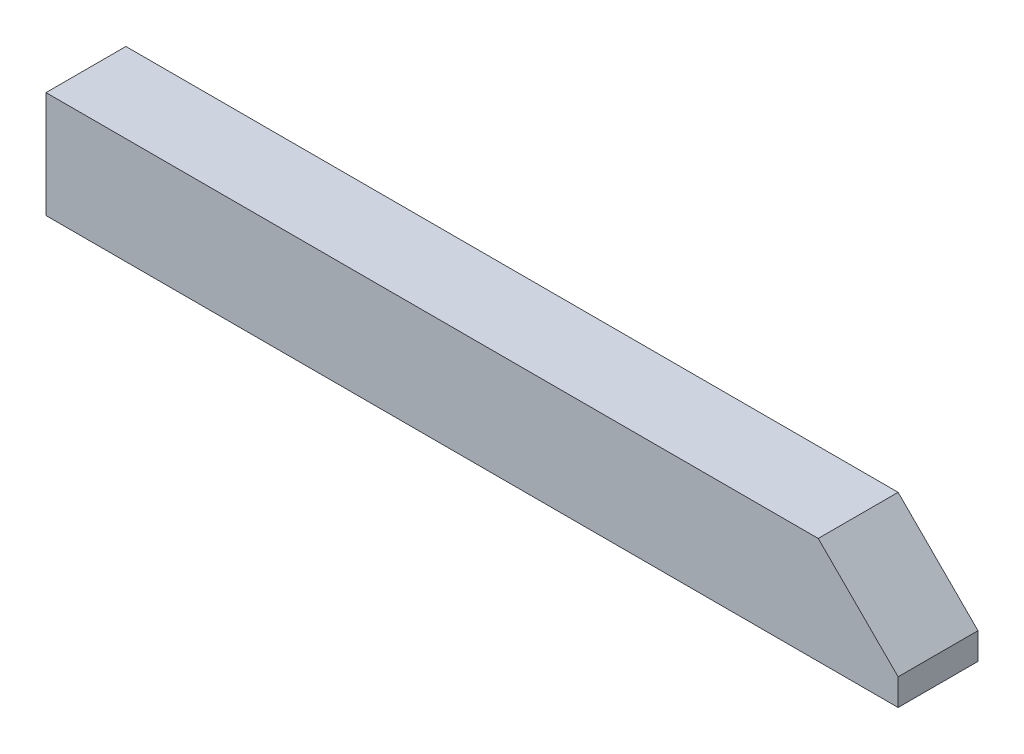
ISO-10303-21;
HEADER;
FILE_DESCRIPTION(('STEP AP214'),'2;1');
FILE_NAME('part.step','',(''),(''),'','','');
FILE_SCHEMA(('AUTOMOTIVE_DESIGN { 1 0 10303 214 1 1 1 1 }'));
ENDSEC;
DATA;
#1=APPLICATION_CONTEXT('core data for automotive mechanical design processes');
#2=APPLICATION_PROTOCOL_DEFINITION('international standard','automotive_design',2000,#1);
#3=PRODUCT_CONTEXT('',#1,'mechanical');
#4=PRODUCT('Part','Part','',(#3));
#5=PRODUCT_RELATED_PRODUCT_CATEGORY('part','',(#4));
#6=PRODUCT_DEFINITION_FORMATION('','',#4);
#7=PRODUCT_DEFINITION_CONTEXT('part definition',#1,'design');
#8=PRODUCT_DEFINITION('design','',#6,#7);
#9=PRODUCT_DEFINITION_SHAPE('','',#8);
#10=(LENGTH_UNIT() NAMED_UNIT(*) SI_UNIT(.MILLI.,.METRE.));
#11=(NAMED_UNIT(*) PLANE_ANGLE_UNIT() SI_UNIT($,.RADIAN.));
#12=(NAMED_UNIT(*) SI_UNIT($,.STERADIAN.) SOLID_ANGLE_UNIT());
#13=UNCERTAINTY_MEASURE_WITH_UNIT(LENGTH_MEASURE(1.E-05),#10,'distance_accuracy_value','');
#14=(GEOMETRIC_REPRESENTATION_CONTEXT(3) GLOBAL_UNCERTAINTY_ASSIGNED_CONTEXT((#13)) GLOBAL_UNIT_ASSIGNED_CONTEXT((#10,
#11,#12)) REPRESENTATION_CONTEXT('',''));
#15=CARTESIAN_POINT('',(0.,0.,0.));
#16=DIRECTION('',(0.,0.,1.));
#17=DIRECTION('',(1.,0.,0.));
#18=AXIS2_PLACEMENT_3D('',#15,#16,#17);
#19=CARTESIAN_POINT('',(51.122900390625,47.080400390625,1.156800003052));
#20=DIRECTION('',(0.,0.,1.));
#21=DIRECTION('',(1.,0.,0.));
#22=AXIS2_PLACEMENT_3D('',#19,#20,#21);
#23=PLANE('',#22);
#24=DIRECTION('',(1.,0.,0.));
#25=VECTOR('',#24,1.);
#26=CARTESIAN_POINT('',(51.122900390625,46.980400390997,1.156800003052));
#27=LINE('',#26,#25);
#28=CARTESIAN_POINT('',(50.322900393605,46.980400390997,1.156800003052));
#29=VERTEX_POINT('',#28);
#30=CARTESIAN_POINT('',(51.922900387645,46.980400390997,1.156800003052));
#31=VERTEX_POINT('',#30);
#32=EDGE_CURVE('E11',#29,#31,#27,.T.);
#33=ORIENTED_EDGE('',*,*,#32,.F.);
#34=DIRECTION('',(0.,-1.,0.));
#35=VECTOR('',#34,1.);
#36=CARTESIAN_POINT('',(50.322900393605,47.080400390625,1.156800003052));
#37=LINE('',#36,#35);
#38=CARTESIAN_POINT('',(50.322900393605,47.180400390252,1.156800003052));
#39=VERTEX_POINT('',#38);
#40=EDGE_CURVE('E101',#39,#29,#37,.T.);
#41=ORIENTED_EDGE('',*,*,#40,.F.);
#42=DIRECTION('',(-1.,0.,0.));
#43=VECTOR('',#42,1.);
#44=CARTESIAN_POINT('',(51.122900390625,47.180400390252,1.156800003052));
#45=LINE('',#44,#43);
#46=CARTESIAN_POINT('',(51.772900387645,47.180400390252,1.156800003052));
#47=VERTEX_POINT('',#46);
#48=EDGE_CURVE('E64',#47,#39,#45,.T.);
#49=ORIENTED_EDGE('',*,*,#48,.F.);
#50=DIRECTION('',(-0.707106781186548,0.707106781186548,0.));
#51=VECTOR('',#50,1.);
#52=CARTESIAN_POINT('',(51.847900387645,47.105400390253,1.156800003052));
#53=LINE('',#52,#51);
#54=CARTESIAN_POINT('',(51.922900387645,47.030400390252,1.156800003052));
#55=VERTEX_POINT('',#54);
#56=EDGE_CURVE('E122',#55,#47,#53,.T.);
#57=ORIENTED_EDGE('',*,*,#56,.F.);
#58=DIRECTION('',(0.,1.,0.));
#59=VECTOR('',#58,1.);
#60=CARTESIAN_POINT('',(51.922900387645,47.080400390625,1.156800003052));
#61=LINE('',#60,#59);
#62=EDGE_CURVE('E26',#31,#55,#61,.T.);
#63=ORIENTED_EDGE('',*,*,#62,.F.);
#64=EDGE_LOOP('',(#33,#41,#49,#57,#63));
#65=FACE_BOUND('',#64,.T.);
#66=ADVANCED_FACE('F17',(#65),#23,.F.);
#67=CARTESIAN_POINT('',(51.122900390625,46.980400390997,1.156800003052));
#68=DIRECTION('',(0.,-1.,0.));
#69=DIRECTION('',(-1.,0.,0.));
#70=AXIS2_PLACEMENT_3D('',#67,#68,#69);
#71=PLANE('',#70);
#72=DIRECTION('',(1.,0.,0.));
#73=VECTOR('',#72,1.);
#74=CARTESIAN_POINT('',(51.122900390625,46.980400390997,1.306800003052));
#75=LINE('',#74,#73);
#76=CARTESIAN_POINT('',(50.322900393605,46.980400390997,1.306800003052));
#77=VERTEX_POINT('',#76);
#78=CARTESIAN_POINT('',(51.922900387645,46.980400390997,1.306800003052));
#79=VERTEX_POINT('',#78);
#80=EDGE_CURVE('E112',#77,#79,#75,.T.);
#81=ORIENTED_EDGE('',*,*,#80,.F.);
#82=DIRECTION('',(0.,0.,1.));
#83=VECTOR('',#82,1.);
#84=CARTESIAN_POINT('',(50.322900393605,46.980400390997,1.156800003052));
#85=LINE('',#84,#83);
#86=EDGE_CURVE('E107',#29,#77,#85,.T.);
#87=ORIENTED_EDGE('',*,*,#86,.F.);
#88=ORIENTED_EDGE('',*,*,#32,.T.);
#89=DIRECTION('',(0.,0.,-1.));
#90=VECTOR('',#89,1.);
#91=CARTESIAN_POINT('',(51.922900387645,46.980400390997,1.156800003052));
#92=LINE('',#91,#90);
#93=EDGE_CURVE('E20',#79,#31,#92,.T.);
#94=ORIENTED_EDGE('',*,*,#93,.F.);
#95=EDGE_LOOP('',(#81,#87,#88,#94));
#96=FACE_BOUND('',#95,.T.);
#97=ADVANCED_FACE('F189',(#96),#71,.T.);
#98=CARTESIAN_POINT('',(51.922900387645,47.080400390625,1.156800003052));
#99=DIRECTION('',(1.,0.,0.));
#100=DIRECTION('',(0.,-1.,0.));
#101=AXIS2_PLACEMENT_3D('',#98,#99,#100);
#102=PLANE('',#101);
#103=DIRECTION('',(0.,0.,-1.));
#104=VECTOR('',#103,1.);
#105=CARTESIAN_POINT('',(51.922900387645,47.030400390252,1.156800003052));
#106=LINE('',#105,#104);
#107=CARTESIAN_POINT('',(51.922900387645,47.030400390252,1.306800003052));
#108=VERTEX_POINT('',#107);
#109=EDGE_CURVE('E76',#108,#55,#106,.T.);
#110=ORIENTED_EDGE('',*,*,#109,.F.);
#111=DIRECTION('',(0.,1.,0.));
#112=VECTOR('',#111,1.);
#113=CARTESIAN_POINT('',(51.922900387645,47.080400390625,1.306800003052));
#114=LINE('',#113,#112);
#115=EDGE_CURVE('E128',#79,#108,#114,.T.);
#116=ORIENTED_EDGE('',*,*,#115,.F.);
#117=ORIENTED_EDGE('',*,*,#93,.T.);
#118=ORIENTED_EDGE('',*,*,#62,.T.);
#119=EDGE_LOOP('',(#110,#116,#117,#118));
#120=FACE_BOUND('',#119,.T.);
#121=ADVANCED_FACE('F183',(#120),#102,.T.);
#122=CARTESIAN_POINT('',(51.847900387645,47.105400390253,1.156800003052));
#123=DIRECTION('',(0.707106781186548,0.707106781186548,0.));
#124=DIRECTION('',(0.,0.,-1.));
#125=AXIS2_PLACEMENT_3D('',#122,#123,#124);
#126=PLANE('',#125);
#127=DIRECTION('',(-0.707106781186548,0.707106781186548,0.));
#128=VECTOR('',#127,1.);
#129=CARTESIAN_POINT('',(51.922900387645,47.030400390252,1.306800003052));
#130=LINE('',#129,#128);
#131=CARTESIAN_POINT('',(51.772900387645,47.180400390252,1.306800003052));
#132=VERTEX_POINT('',#131);
#133=EDGE_CURVE('E102',#108,#132,#130,.T.);
#134=ORIENTED_EDGE('',*,*,#133,.F.);
#135=ORIENTED_EDGE('',*,*,#109,.T.);
#136=ORIENTED_EDGE('',*,*,#56,.T.);
#137=DIRECTION('',(0.,0.,-1.));
#138=VECTOR('',#137,1.);
#139=CARTESIAN_POINT('',(51.772900387645,47.180400390252,1.156800003052));
#140=LINE('',#139,#138);
#141=EDGE_CURVE('E88',#132,#47,#140,.T.);
#142=ORIENTED_EDGE('',*,*,#141,.F.);
#143=EDGE_LOOP('',(#134,#135,#136,#142));
#144=FACE_BOUND('',#143,.T.);
#145=ADVANCED_FACE('F188',(#144),#126,.T.);
#146=CARTESIAN_POINT('',(51.122900390625,47.180400390252,1.156800003052));
#147=DIRECTION('',(0.,1.,0.));
#148=DIRECTION('',(1.,0.,0.));
#149=AXIS2_PLACEMENT_3D('',#146,#147,#148);
#150=PLANE('',#149);
#151=ORIENTED_EDGE('',*,*,#141,.T.);
#152=ORIENTED_EDGE('',*,*,#48,.T.);
#153=DIRECTION('',(0.,0.,-1.));
#154=VECTOR('',#153,1.);
#155=CARTESIAN_POINT('',(50.322900393605,47.180400390252,1.156800003052));
#156=LINE('',#155,#154);
#157=CARTESIAN_POINT('',(50.322900393605,47.180400390252,1.306800003052));
#158=VERTEX_POINT('',#157);
#159=EDGE_CURVE('E93',#158,#39,#156,.T.);
#160=ORIENTED_EDGE('',*,*,#159,.F.);
#161=DIRECTION('',(-1.,0.,0.));
#162=VECTOR('',#161,1.);
#163=CARTESIAN_POINT('',(51.122900390625,47.180400390252,1.306800003052));
#164=LINE('',#163,#162);
#165=EDGE_CURVE('E97',#132,#158,#164,.T.);
#166=ORIENTED_EDGE('',*,*,#165,.F.);
#167=EDGE_LOOP('',(#151,#152,#160,#166));
#168=FACE_BOUND('',#167,.T.);
#169=ADVANCED_FACE('F95',(#168),#150,.T.);
#170=CARTESIAN_POINT('',(50.322900393605,47.080400390625,1.156800003052));
#171=DIRECTION('',(-1.,0.,0.));
#172=DIRECTION('',(0.,0.,1.));
#173=AXIS2_PLACEMENT_3D('',#170,#171,#172);
#174=PLANE('',#173);
#175=DIRECTION('',(0.,-1.,0.));
#176=VECTOR('',#175,1.);
#177=CARTESIAN_POINT('',(50.322900393605,47.080400390625,1.306800003052));
#178=LINE('',#177,#176);
#179=EDGE_CURVE('E105',#158,#77,#178,.T.);
#180=ORIENTED_EDGE('',*,*,#179,.F.);
#181=ORIENTED_EDGE('',*,*,#159,.T.);
#182=ORIENTED_EDGE('',*,*,#40,.T.);
#183=ORIENTED_EDGE('',*,*,#86,.T.);
#184=EDGE_LOOP('',(#180,#181,#182,#183));
#185=FACE_BOUND('',#184,.T.);
#186=ADVANCED_FACE('F106',(#185),#174,.T.);
#187=CARTESIAN_POINT('',(51.122900390625,47.080400390625,1.306800003052));
#188=DIRECTION('',(0.,0.,1.));
#189=DIRECTION('',(1.,0.,0.));
#190=AXIS2_PLACEMENT_3D('',#187,#188,#189);
#191=PLANE('',#190);
#192=ORIENTED_EDGE('',*,*,#165,.T.);
#193=ORIENTED_EDGE('',*,*,#179,.T.);
#194=ORIENTED_EDGE('',*,*,#80,.T.);
#195=ORIENTED_EDGE('',*,*,#115,.T.);
#196=ORIENTED_EDGE('',*,*,#133,.T.);
#197=EDGE_LOOP('',(#192,#193,#194,#195,#196));
#198=FACE_BOUND('',#197,.T.);
#199=ADVANCED_FACE('F114',(#198),#191,.T.);
#200=CLOSED_SHELL('',(#66,#97,#121,#145,#169,#186,#199));
#201=MANIFOLD_SOLID_BREP('B1',#200);
#202=ADVANCED_BREP_SHAPE_REPRESENTATION('',(#18,#201),#14);
#203=SHAPE_DEFINITION_REPRESENTATION(#9,#202);
ENDSEC;
END-ISO-10303-21;
